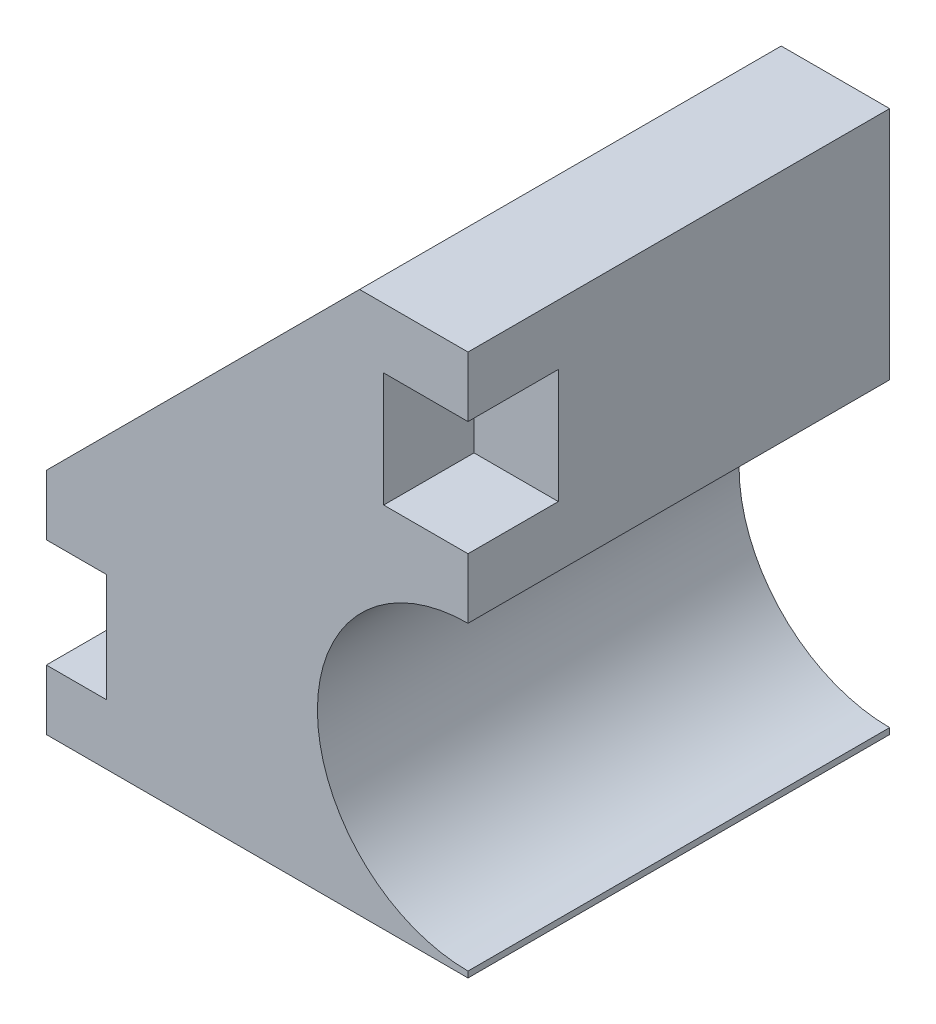
ISO-10303-21;
HEADER;
FILE_DESCRIPTION(('STEP AP214'),'2;1');
FILE_NAME('part.step','',(''),(''),'','','');
FILE_SCHEMA(('AUTOMOTIVE_DESIGN { 1 0 10303 214 1 1 1 1 }'));
ENDSEC;
DATA;
#1=APPLICATION_CONTEXT('core data for automotive mechanical design processes');
#2=APPLICATION_PROTOCOL_DEFINITION('international standard','automotive_design',2000,#1);
#3=PRODUCT_CONTEXT('',#1,'mechanical');
#4=PRODUCT('Part','Part','',(#3));
#5=PRODUCT_RELATED_PRODUCT_CATEGORY('part','',(#4));
#6=PRODUCT_DEFINITION_FORMATION('','',#4);
#7=PRODUCT_DEFINITION_CONTEXT('part definition',#1,'design');
#8=PRODUCT_DEFINITION('design','',#6,#7);
#9=PRODUCT_DEFINITION_SHAPE('','',#8);
#10=(LENGTH_UNIT() NAMED_UNIT(*) SI_UNIT(.MILLI.,.METRE.));
#11=(NAMED_UNIT(*) PLANE_ANGLE_UNIT() SI_UNIT($,.RADIAN.));
#12=(NAMED_UNIT(*) SI_UNIT($,.STERADIAN.) SOLID_ANGLE_UNIT());
#13=UNCERTAINTY_MEASURE_WITH_UNIT(LENGTH_MEASURE(1.E-05),#10,'distance_accuracy_value','');
#14=(GEOMETRIC_REPRESENTATION_CONTEXT(3) GLOBAL_UNCERTAINTY_ASSIGNED_CONTEXT((#13)) GLOBAL_UNIT_ASSIGNED_CONTEXT((#10,
#11,#12)) REPRESENTATION_CONTEXT('',''));
#15=CARTESIAN_POINT('',(0.,0.,0.));
#16=DIRECTION('',(0.,0.,1.));
#17=DIRECTION('',(1.,0.,0.));
#18=AXIS2_PLACEMENT_3D('',#15,#16,#17);
#19=CARTESIAN_POINT('',(0.,13.,0.));
#20=DIRECTION('',(0.,0.,1.));
#21=DIRECTION('',(1.,0.,0.));
#22=AXIS2_PLACEMENT_3D('',#19,#20,#21);
#23=PLANE('',#22);
#24=DIRECTION('',(0.,1.,0.));
#25=VECTOR('',#24,1.);
#26=CARTESIAN_POINT('',(0.,0.5,0.));
#27=LINE('',#26,#25);
#28=CARTESIAN_POINT('',(0.,0.,0.));
#29=VERTEX_POINT('',#28);
#30=CARTESIAN_POINT('',(0.,0.5,0.));
#31=VERTEX_POINT('',#30);
#32=EDGE_CURVE('E242',#29,#31,#27,.T.);
#33=ORIENTED_EDGE('',*,*,#32,.F.);
#34=DIRECTION('',(1.,0.,0.));
#35=VECTOR('',#34,1.);
#36=CARTESIAN_POINT('',(0.,0.,0.));
#37=LINE('',#36,#35);
#38=CARTESIAN_POINT('',(-35.,0.,0.));
#39=VERTEX_POINT('',#38);
#40=EDGE_CURVE('E266',#39,#29,#37,.T.);
#41=ORIENTED_EDGE('',*,*,#40,.F.);
#42=DIRECTION('',(0.,-1.,0.));
#43=VECTOR('',#42,1.);
#44=CARTESIAN_POINT('',(-35.,18.9999999999999,0.));
#45=LINE('',#44,#43);
#46=CARTESIAN_POINT('',(-35.,18.9999999999999,0.));
#47=VERTEX_POINT('',#46);
#48=EDGE_CURVE('E262',#47,#39,#45,.T.);
#49=ORIENTED_EDGE('',*,*,#48,.F.);
#50=DIRECTION('',(-0.707106781186546,-0.707106781186549,0.));
#51=VECTOR('',#50,1.);
#52=CARTESIAN_POINT('',(-9.,45.,0.));
#53=LINE('',#52,#51);
#54=CARTESIAN_POINT('',(-9.,45.,0.));
#55=VERTEX_POINT('',#54);
#56=EDGE_CURVE('E258',#55,#47,#53,.T.);
#57=ORIENTED_EDGE('',*,*,#56,.F.);
#58=DIRECTION('',(-1.,0.,0.));
#59=VECTOR('',#58,1.);
#60=CARTESIAN_POINT('',(0.,45.,0.));
#61=LINE('',#60,#59);
#62=CARTESIAN_POINT('',(0.,45.,0.));
#63=VERTEX_POINT('',#62);
#64=EDGE_CURVE('E254',#63,#55,#61,.T.);
#65=ORIENTED_EDGE('',*,*,#64,.F.);
#66=DIRECTION('',(0.,1.,0.));
#67=VECTOR('',#66,1.);
#68=CARTESIAN_POINT('',(0.,45.,0.));
#69=LINE('',#68,#67);
#70=CARTESIAN_POINT('',(0.,25.5,0.));
#71=VERTEX_POINT('',#70);
#72=EDGE_CURVE('E250',#71,#63,#69,.T.);
#73=ORIENTED_EDGE('',*,*,#72,.F.);
#74=CARTESIAN_POINT('',(0.,13.,0.));
#75=DIRECTION('',(0.,0.,-1.));
#76=DIRECTION('',(1.,0.,0.));
#77=AXIS2_PLACEMENT_3D('',#74,#75,#76);
#78=CIRCLE('',#77,12.5);
#79=EDGE_CURVE('E246',#31,#71,#78,.T.);
#80=ORIENTED_EDGE('',*,*,#79,.F.);
#81=EDGE_LOOP('',(#33,#41,#49,#57,#65,#73,#80));
#82=FACE_BOUND('',#81,.T.);
#83=ADVANCED_FACE('F39',(#82),#23,.F.);
#84=CARTESIAN_POINT('',(0.,0.,150.));
#85=DIRECTION('',(0.,1.,0.));
#86=DIRECTION('',(-1.,0.,0.));
#87=AXIS2_PLACEMENT_3D('',#84,#85,#86);
#88=PLANE('',#87);
#89=DIRECTION('',(0.,0.,-1.));
#90=VECTOR('',#89,1.);
#91=CARTESIAN_POINT('',(0.,0.,150.));
#92=LINE('',#91,#90);
#93=CARTESIAN_POINT('',(0.,0.,35.));
#94=VERTEX_POINT('',#93);
#95=EDGE_CURVE('E270',#94,#29,#92,.T.);
#96=ORIENTED_EDGE('',*,*,#95,.F.);
#97=DIRECTION('',(1.,0.,0.));
#98=VECTOR('',#97,1.);
#99=CARTESIAN_POINT('',(-35.,0.,35.));
#100=LINE('',#99,#98);
#101=CARTESIAN_POINT('',(-35.,0.,35.));
#102=VERTEX_POINT('',#101);
#103=EDGE_CURVE('E210',#102,#94,#100,.T.);
#104=ORIENTED_EDGE('',*,*,#103,.F.);
#105=DIRECTION('',(0.,0.,-1.));
#106=VECTOR('',#105,1.);
#107=CARTESIAN_POINT('',(-35.,0.,150.));
#108=LINE('',#107,#106);
#109=EDGE_CURVE('E273',#102,#39,#108,.T.);
#110=ORIENTED_EDGE('',*,*,#109,.T.);
#111=ORIENTED_EDGE('',*,*,#40,.T.);
#112=EDGE_LOOP('',(#96,#104,#110,#111));
#113=FACE_BOUND('',#112,.T.);
#114=ADVANCED_FACE('F338',(#113),#88,.F.);
#115=CARTESIAN_POINT('',(-35.,18.9999999999999,150.));
#116=DIRECTION('',(1.,0.,0.));
#117=DIRECTION('',(0.,0.,-1.));
#118=AXIS2_PLACEMENT_3D('',#115,#116,#117);
#119=PLANE('',#118);
#120=DIRECTION('',(0.,-1.,0.));
#121=VECTOR('',#120,1.);
#122=CARTESIAN_POINT('',(-35.,150.,35.));
#123=LINE('',#122,#121);
#124=CARTESIAN_POINT('',(-35.,5.,35.));
#125=VERTEX_POINT('',#124);
#126=EDGE_CURVE('E221',#125,#102,#123,.T.);
#127=ORIENTED_EDGE('',*,*,#126,.F.);
#128=DIRECTION('',(0.,0.,1.));
#129=VECTOR('',#128,1.);
#130=CARTESIAN_POINT('',(-35.,5.,35.));
#131=LINE('',#130,#129);
#132=CARTESIAN_POINT('',(-35.,4.99999999999999,27.5));
#133=VERTEX_POINT('',#132);
#134=EDGE_CURVE('E166',#133,#125,#131,.T.);
#135=ORIENTED_EDGE('',*,*,#134,.F.);
#136=DIRECTION('',(0.,-1.,0.));
#137=VECTOR('',#136,1.);
#138=CARTESIAN_POINT('',(-35.,13.9999999999999,27.5));
#139=LINE('',#138,#137);
#140=CARTESIAN_POINT('',(-35.,13.9999999999999,27.5));
#141=VERTEX_POINT('',#140);
#142=EDGE_CURVE('E319',#141,#133,#139,.T.);
#143=ORIENTED_EDGE('',*,*,#142,.F.);
#144=DIRECTION('',(0.,0.,-1.));
#145=VECTOR('',#144,1.);
#146=CARTESIAN_POINT('',(-35.,13.9999999999999,35.));
#147=LINE('',#146,#145);
#148=CARTESIAN_POINT('',(-35.,13.9999999999999,35.));
#149=VERTEX_POINT('',#148);
#150=EDGE_CURVE('E322',#149,#141,#147,.T.);
#151=ORIENTED_EDGE('',*,*,#150,.F.);
#152=CARTESIAN_POINT('',(-35.,18.9999999999999,35.));
#153=VERTEX_POINT('',#152);
#154=EDGE_CURVE('E171',#153,#149,#123,.T.);
#155=ORIENTED_EDGE('',*,*,#154,.F.);
#156=DIRECTION('',(0.,0.,-1.));
#157=VECTOR('',#156,1.);
#158=CARTESIAN_POINT('',(-35.,18.9999999999999,150.));
#159=LINE('',#158,#157);
#160=EDGE_CURVE('E276',#153,#47,#159,.T.);
#161=ORIENTED_EDGE('',*,*,#160,.T.);
#162=ORIENTED_EDGE('',*,*,#48,.T.);
#163=ORIENTED_EDGE('',*,*,#109,.F.);
#164=EDGE_LOOP('',(#127,#135,#143,#151,#155,#161,#162,#163));
#165=FACE_BOUND('',#164,.T.);
#166=ADVANCED_FACE('F333',(#165),#119,.F.);
#167=CARTESIAN_POINT('',(-9.,45.,150.));
#168=DIRECTION('',(0.707106781186549,-0.707106781186546,0.));
#169=DIRECTION('',(0.707106781186546,0.707106781186549,0.));
#170=AXIS2_PLACEMENT_3D('',#167,#168,#169);
#171=PLANE('',#170);
#172=ORIENTED_EDGE('',*,*,#160,.F.);
#173=DIRECTION('',(0.707106781186546,0.707106781186549,0.));
#174=VECTOR('',#173,1.);
#175=CARTESIAN_POINT('',(-9.,45.,35.));
#176=LINE('',#175,#174);
#177=CARTESIAN_POINT('',(-9.,45.,35.));
#178=VERTEX_POINT('',#177);
#179=EDGE_CURVE('E230',#153,#178,#176,.T.);
#180=ORIENTED_EDGE('',*,*,#179,.T.);
#181=DIRECTION('',(0.,0.,-1.));
#182=VECTOR('',#181,1.);
#183=CARTESIAN_POINT('',(-9.,45.,150.));
#184=LINE('',#183,#182);
#185=EDGE_CURVE('E279',#178,#55,#184,.T.);
#186=ORIENTED_EDGE('',*,*,#185,.T.);
#187=ORIENTED_EDGE('',*,*,#56,.T.);
#188=EDGE_LOOP('',(#172,#180,#186,#187));
#189=FACE_BOUND('',#188,.T.);
#190=ADVANCED_FACE('F357',(#189),#171,.F.);
#191=CARTESIAN_POINT('',(0.,45.,150.));
#192=DIRECTION('',(0.,-1.,0.));
#193=DIRECTION('',(0.,0.,-1.));
#194=AXIS2_PLACEMENT_3D('',#191,#192,#193);
#195=PLANE('',#194);
#196=ORIENTED_EDGE('',*,*,#185,.F.);
#197=DIRECTION('',(1.,0.,0.));
#198=VECTOR('',#197,1.);
#199=CARTESIAN_POINT('',(0.,45.,35.));
#200=LINE('',#199,#198);
#201=CARTESIAN_POINT('',(0.,45.,35.));
#202=VERTEX_POINT('',#201);
#203=EDGE_CURVE('E234',#178,#202,#200,.T.);
#204=ORIENTED_EDGE('',*,*,#203,.T.);
#205=DIRECTION('',(0.,0.,-1.));
#206=VECTOR('',#205,1.);
#207=CARTESIAN_POINT('',(0.,45.,150.));
#208=LINE('',#207,#206);
#209=EDGE_CURVE('E282',#202,#63,#208,.T.);
#210=ORIENTED_EDGE('',*,*,#209,.T.);
#211=ORIENTED_EDGE('',*,*,#64,.T.);
#212=EDGE_LOOP('',(#196,#204,#210,#211));
#213=FACE_BOUND('',#212,.T.);
#214=ADVANCED_FACE('F305',(#213),#195,.F.);
#215=CARTESIAN_POINT('',(0.,45.,150.));
#216=DIRECTION('',(-1.,0.,0.));
#217=DIRECTION('',(0.,-1.,0.));
#218=AXIS2_PLACEMENT_3D('',#215,#216,#217);
#219=PLANE('',#218);
#220=DIRECTION('',(0.,-1.,0.));
#221=VECTOR('',#220,1.);
#222=CARTESIAN_POINT('',(0.,150.,35.));
#223=LINE('',#222,#221);
#224=CARTESIAN_POINT('',(0.,40.,35.));
#225=VERTEX_POINT('',#224);
#226=EDGE_CURVE('E227',#202,#225,#223,.T.);
#227=ORIENTED_EDGE('',*,*,#226,.T.);
#228=DIRECTION('',(0.,0.,1.));
#229=VECTOR('',#228,1.);
#230=CARTESIAN_POINT('',(0.,40.,35.));
#231=LINE('',#230,#229);
#232=CARTESIAN_POINT('',(0.,40.,27.5));
#233=VERTEX_POINT('',#232);
#234=EDGE_CURVE('E185',#233,#225,#231,.T.);
#235=ORIENTED_EDGE('',*,*,#234,.F.);
#236=DIRECTION('',(0.,1.,0.));
#237=VECTOR('',#236,1.);
#238=CARTESIAN_POINT('',(0.,40.,27.5));
#239=LINE('',#238,#237);
#240=CARTESIAN_POINT('',(0.,30.5,27.5));
#241=VERTEX_POINT('',#240);
#242=EDGE_CURVE('E199',#241,#233,#239,.T.);
#243=ORIENTED_EDGE('',*,*,#242,.F.);
#244=DIRECTION('',(0.,0.,-1.));
#245=VECTOR('',#244,1.);
#246=CARTESIAN_POINT('',(0.,30.5,35.));
#247=LINE('',#246,#245);
#248=CARTESIAN_POINT('',(0.,30.5,35.));
#249=VERTEX_POINT('',#248);
#250=EDGE_CURVE('E195',#249,#241,#247,.T.);
#251=ORIENTED_EDGE('',*,*,#250,.F.);
#252=CARTESIAN_POINT('',(0.,25.5,35.));
#253=VERTEX_POINT('',#252);
#254=EDGE_CURVE('E226',#249,#253,#223,.T.);
#255=ORIENTED_EDGE('',*,*,#254,.T.);
#256=DIRECTION('',(0.,0.,-1.));
#257=VECTOR('',#256,1.);
#258=CARTESIAN_POINT('',(0.,25.5,150.));
#259=LINE('',#258,#257);
#260=EDGE_CURVE('E48',#253,#71,#259,.T.);
#261=ORIENTED_EDGE('',*,*,#260,.T.);
#262=ORIENTED_EDGE('',*,*,#72,.T.);
#263=ORIENTED_EDGE('',*,*,#209,.F.);
#264=EDGE_LOOP('',(#227,#235,#243,#251,#255,#261,#262,#263));
#265=FACE_BOUND('',#264,.T.);
#266=ADVANCED_FACE('F288',(#265),#219,.F.);
#267=CARTESIAN_POINT('',(0.,13.,150.));
#268=DIRECTION('',(0.,0.,-1.));
#269=DIRECTION('',(-1.,0.,0.));
#270=AXIS2_PLACEMENT_3D('',#267,#268,#269);
#271=CYLINDRICAL_SURFACE('',#270,12.5);
#272=ORIENTED_EDGE('',*,*,#260,.F.);
#273=CARTESIAN_POINT('',(0.,13.,35.));
#274=DIRECTION('',(0.,0.,-1.));
#275=DIRECTION('',(-1.,0.,0.));
#276=AXIS2_PLACEMENT_3D('',#273,#274,#275);
#277=CIRCLE('',#276,12.5);
#278=CARTESIAN_POINT('',(0.,0.5,35.));
#279=VERTEX_POINT('',#278);
#280=EDGE_CURVE('E238',#253,#279,#277,.F.);
#281=ORIENTED_EDGE('',*,*,#280,.T.);
#282=DIRECTION('',(0.,0.,-1.));
#283=VECTOR('',#282,1.);
#284=CARTESIAN_POINT('',(0.,0.5,150.));
#285=LINE('',#284,#283);
#286=EDGE_CURVE('E11',#279,#31,#285,.T.);
#287=ORIENTED_EDGE('',*,*,#286,.T.);
#288=ORIENTED_EDGE('',*,*,#79,.T.);
#289=EDGE_LOOP('',(#272,#281,#287,#288));
#290=FACE_BOUND('',#289,.T.);
#291=ADVANCED_FACE('F297',(#290),#271,.F.);
#292=CARTESIAN_POINT('',(0.,0.5,150.));
#293=DIRECTION('',(-1.,0.,0.));
#294=DIRECTION('',(0.,-1.,0.));
#295=AXIS2_PLACEMENT_3D('',#292,#293,#294);
#296=PLANE('',#295);
#297=ORIENTED_EDGE('',*,*,#286,.F.);
#298=EDGE_CURVE('E222',#279,#94,#223,.T.);
#299=ORIENTED_EDGE('',*,*,#298,.T.);
#300=ORIENTED_EDGE('',*,*,#95,.T.);
#301=ORIENTED_EDGE('',*,*,#32,.T.);
#302=EDGE_LOOP('',(#297,#299,#300,#301));
#303=FACE_BOUND('',#302,.T.);
#304=ADVANCED_FACE('F41',(#303),#296,.F.);
#305=CARTESIAN_POINT('',(-35.,150.,35.));
#306=DIRECTION('',(0.,0.,-1.));
#307=DIRECTION('',(-1.,0.,0.));
#308=AXIS2_PLACEMENT_3D('',#305,#306,#307);
#309=PLANE('',#308);
#310=DIRECTION('',(0.,1.,0.));
#311=VECTOR('',#310,1.);
#312=CARTESIAN_POINT('',(-30.,13.9999999999999,35.));
#313=LINE('',#312,#311);
#314=CARTESIAN_POINT('',(-30.,5.,35.));
#315=VERTEX_POINT('',#314);
#316=CARTESIAN_POINT('',(-30.,13.9999999999999,35.));
#317=VERTEX_POINT('',#316);
#318=EDGE_CURVE('E159',#315,#317,#313,.T.);
#319=ORIENTED_EDGE('',*,*,#318,.F.);
#320=DIRECTION('',(-1.,0.,0.));
#321=VECTOR('',#320,1.);
#322=CARTESIAN_POINT('',(-30.,5.,35.));
#323=LINE('',#322,#321);
#324=EDGE_CURVE('E200',#315,#125,#323,.T.);
#325=ORIENTED_EDGE('',*,*,#324,.T.);
#326=ORIENTED_EDGE('',*,*,#126,.T.);
#327=ORIENTED_EDGE('',*,*,#103,.T.);
#328=ORIENTED_EDGE('',*,*,#298,.F.);
#329=ORIENTED_EDGE('',*,*,#280,.F.);
#330=ORIENTED_EDGE('',*,*,#254,.F.);
#331=DIRECTION('',(1.,0.,0.));
#332=VECTOR('',#331,1.);
#333=CARTESIAN_POINT('',(-7.,30.5,35.));
#334=LINE('',#333,#332);
#335=CARTESIAN_POINT('',(-7.,30.5,35.));
#336=VERTEX_POINT('',#335);
#337=EDGE_CURVE('E194',#336,#249,#334,.T.);
#338=ORIENTED_EDGE('',*,*,#337,.F.);
#339=DIRECTION('',(0.,-1.,0.));
#340=VECTOR('',#339,1.);
#341=CARTESIAN_POINT('',(-7.,40.,35.));
#342=LINE('',#341,#340);
#343=CARTESIAN_POINT('',(-7.,40.,35.));
#344=VERTEX_POINT('',#343);
#345=EDGE_CURVE('E181',#344,#336,#342,.T.);
#346=ORIENTED_EDGE('',*,*,#345,.F.);
#347=DIRECTION('',(1.,0.,0.));
#348=VECTOR('',#347,1.);
#349=CARTESIAN_POINT('',(-7.,40.,35.));
#350=LINE('',#349,#348);
#351=EDGE_CURVE('E206',#344,#225,#350,.T.);
#352=ORIENTED_EDGE('',*,*,#351,.T.);
#353=ORIENTED_EDGE('',*,*,#226,.F.);
#354=ORIENTED_EDGE('',*,*,#203,.F.);
#355=ORIENTED_EDGE('',*,*,#179,.F.);
#356=ORIENTED_EDGE('',*,*,#154,.T.);
#357=DIRECTION('',(-1.,0.,0.));
#358=VECTOR('',#357,1.);
#359=CARTESIAN_POINT('',(-30.,13.9999999999999,35.));
#360=LINE('',#359,#358);
#361=EDGE_CURVE('E153',#317,#149,#360,.T.);
#362=ORIENTED_EDGE('',*,*,#361,.F.);
#363=EDGE_LOOP('',(#319,#325,#326,#327,#328,#329,#330,#338,#346,#352,#353,#354,#355,#356,#362));
#364=FACE_BOUND('',#363,.T.);
#365=ADVANCED_FACE('F169',(#364),#309,.F.);
#366=CARTESIAN_POINT('',(-7.,40.,35.));
#367=DIRECTION('',(0.,1.,0.));
#368=DIRECTION('',(-1.,0.,0.));
#369=AXIS2_PLACEMENT_3D('',#366,#367,#368);
#370=PLANE('',#369);
#371=ORIENTED_EDGE('',*,*,#234,.T.);
#372=ORIENTED_EDGE('',*,*,#351,.F.);
#373=DIRECTION('',(0.,0.,1.));
#374=VECTOR('',#373,1.);
#375=CARTESIAN_POINT('',(-7.,40.,35.));
#376=LINE('',#375,#374);
#377=CARTESIAN_POINT('',(-7.,40.,27.5));
#378=VERTEX_POINT('',#377);
#379=EDGE_CURVE('E63',#378,#344,#376,.T.);
#380=ORIENTED_EDGE('',*,*,#379,.F.);
#381=DIRECTION('',(1.,0.,0.));
#382=VECTOR('',#381,1.);
#383=CARTESIAN_POINT('',(-7.,40.,27.5));
#384=LINE('',#383,#382);
#385=EDGE_CURVE('E211',#378,#233,#384,.T.);
#386=ORIENTED_EDGE('',*,*,#385,.T.);
#387=EDGE_LOOP('',(#371,#372,#380,#386));
#388=FACE_BOUND('',#387,.T.);
#389=ADVANCED_FACE('F345',(#388),#370,.F.);
#390=CARTESIAN_POINT('',(-7.,40.,27.5));
#391=DIRECTION('',(0.,0.,-1.));
#392=DIRECTION('',(-1.,0.,0.));
#393=AXIS2_PLACEMENT_3D('',#390,#391,#392);
#394=PLANE('',#393);
#395=ORIENTED_EDGE('',*,*,#242,.T.);
#396=ORIENTED_EDGE('',*,*,#385,.F.);
#397=DIRECTION('',(0.,1.,0.));
#398=VECTOR('',#397,1.);
#399=CARTESIAN_POINT('',(-7.,40.,27.5));
#400=LINE('',#399,#398);
#401=CARTESIAN_POINT('',(-7.,30.5,27.5));
#402=VERTEX_POINT('',#401);
#403=EDGE_CURVE('E189',#402,#378,#400,.T.);
#404=ORIENTED_EDGE('',*,*,#403,.F.);
#405=DIRECTION('',(1.,0.,0.));
#406=VECTOR('',#405,1.);
#407=CARTESIAN_POINT('',(-7.,30.5,27.5));
#408=LINE('',#407,#406);
#409=EDGE_CURVE('E214',#402,#241,#408,.T.);
#410=ORIENTED_EDGE('',*,*,#409,.T.);
#411=EDGE_LOOP('',(#395,#396,#404,#410));
#412=FACE_BOUND('',#411,.T.);
#413=ADVANCED_FACE('F414',(#412),#394,.F.);
#414=CARTESIAN_POINT('',(-7.,30.5,35.));
#415=DIRECTION('',(0.,-1.,0.));
#416=DIRECTION('',(1.,0.,0.));
#417=AXIS2_PLACEMENT_3D('',#414,#415,#416);
#418=PLANE('',#417);
#419=ORIENTED_EDGE('',*,*,#250,.T.);
#420=ORIENTED_EDGE('',*,*,#409,.F.);
#421=DIRECTION('',(0.,0.,-1.));
#422=VECTOR('',#421,1.);
#423=CARTESIAN_POINT('',(-7.,30.5,35.));
#424=LINE('',#423,#422);
#425=EDGE_CURVE('E184',#336,#402,#424,.T.);
#426=ORIENTED_EDGE('',*,*,#425,.F.);
#427=ORIENTED_EDGE('',*,*,#337,.T.);
#428=EDGE_LOOP('',(#419,#420,#426,#427));
#429=FACE_BOUND('',#428,.T.);
#430=ADVANCED_FACE('F423',(#429),#418,.F.);
#431=CARTESIAN_POINT('',(-7.,0.,0.));
#432=DIRECTION('',(1.,0.,0.));
#433=DIRECTION('',(0.,1.,0.));
#434=AXIS2_PLACEMENT_3D('',#431,#432,#433);
#435=PLANE('',#434);
#436=ORIENTED_EDGE('',*,*,#345,.T.);
#437=ORIENTED_EDGE('',*,*,#425,.T.);
#438=ORIENTED_EDGE('',*,*,#403,.T.);
#439=ORIENTED_EDGE('',*,*,#379,.T.);
#440=EDGE_LOOP('',(#436,#437,#438,#439));
#441=FACE_BOUND('',#440,.T.);
#442=ADVANCED_FACE('F432',(#441),#435,.T.);
#443=CARTESIAN_POINT('',(-30.,5.,35.));
#444=DIRECTION('',(0.,-1.,0.));
#445=DIRECTION('',(0.,0.,-1.));
#446=AXIS2_PLACEMENT_3D('',#443,#444,#445);
#447=PLANE('',#446);
#448=ORIENTED_EDGE('',*,*,#134,.T.);
#449=ORIENTED_EDGE('',*,*,#324,.F.);
#450=DIRECTION('',(0.,0.,1.));
#451=VECTOR('',#450,1.);
#452=CARTESIAN_POINT('',(-30.,5.,35.));
#453=LINE('',#452,#451);
#454=CARTESIAN_POINT('',(-30.,4.99999999999999,27.5));
#455=VERTEX_POINT('',#454);
#456=EDGE_CURVE('E55',#455,#315,#453,.T.);
#457=ORIENTED_EDGE('',*,*,#456,.F.);
#458=DIRECTION('',(-1.,0.,0.));
#459=VECTOR('',#458,1.);
#460=CARTESIAN_POINT('',(-30.,4.99999999999999,27.5));
#461=LINE('',#460,#459);
#462=EDGE_CURVE('E176',#455,#133,#461,.T.);
#463=ORIENTED_EDGE('',*,*,#462,.T.);
#464=EDGE_LOOP('',(#448,#449,#457,#463));
#465=FACE_BOUND('',#464,.T.);
#466=ADVANCED_FACE('F327',(#465),#447,.F.);
#467=CARTESIAN_POINT('',(-30.,13.9999999999999,27.5));
#468=DIRECTION('',(0.,0.,-1.));
#469=DIRECTION('',(-1.,0.,0.));
#470=AXIS2_PLACEMENT_3D('',#467,#468,#469);
#471=PLANE('',#470);
#472=ORIENTED_EDGE('',*,*,#142,.T.);
#473=ORIENTED_EDGE('',*,*,#462,.F.);
#474=DIRECTION('',(0.,-1.,0.));
#475=VECTOR('',#474,1.);
#476=CARTESIAN_POINT('',(-30.,13.9999999999999,27.5));
#477=LINE('',#476,#475);
#478=CARTESIAN_POINT('',(-30.,13.9999999999999,27.5));
#479=VERTEX_POINT('',#478);
#480=EDGE_CURVE('E158',#479,#455,#477,.T.);
#481=ORIENTED_EDGE('',*,*,#480,.F.);
#482=DIRECTION('',(-1.,0.,0.));
#483=VECTOR('',#482,1.);
#484=CARTESIAN_POINT('',(-30.,13.9999999999999,27.5));
#485=LINE('',#484,#483);
#486=EDGE_CURVE('E155',#479,#141,#485,.T.);
#487=ORIENTED_EDGE('',*,*,#486,.T.);
#488=EDGE_LOOP('',(#472,#473,#481,#487));
#489=FACE_BOUND('',#488,.T.);
#490=ADVANCED_FACE('F446',(#489),#471,.F.);
#491=CARTESIAN_POINT('',(-30.,13.9999999999999,35.));
#492=DIRECTION('',(0.,1.,0.));
#493=DIRECTION('',(0.,0.,1.));
#494=AXIS2_PLACEMENT_3D('',#491,#492,#493);
#495=PLANE('',#494);
#496=ORIENTED_EDGE('',*,*,#150,.T.);
#497=ORIENTED_EDGE('',*,*,#486,.F.);
#498=DIRECTION('',(0.,0.,-1.));
#499=VECTOR('',#498,1.);
#500=CARTESIAN_POINT('',(-30.,13.9999999999999,35.));
#501=LINE('',#500,#499);
#502=EDGE_CURVE('E149',#317,#479,#501,.T.);
#503=ORIENTED_EDGE('',*,*,#502,.F.);
#504=ORIENTED_EDGE('',*,*,#361,.T.);
#505=EDGE_LOOP('',(#496,#497,#503,#504));
#506=FACE_BOUND('',#505,.T.);
#507=ADVANCED_FACE('F151',(#506),#495,.F.);
#508=CARTESIAN_POINT('',(-30.,0.,0.));
#509=DIRECTION('',(1.,0.,0.));
#510=DIRECTION('',(0.,0.,-1.));
#511=AXIS2_PLACEMENT_3D('',#508,#509,#510);
#512=PLANE('',#511);
#513=ORIENTED_EDGE('',*,*,#318,.T.);
#514=ORIENTED_EDGE('',*,*,#502,.T.);
#515=ORIENTED_EDGE('',*,*,#480,.T.);
#516=ORIENTED_EDGE('',*,*,#456,.T.);
#517=EDGE_LOOP('',(#513,#514,#515,#516));
#518=FACE_BOUND('',#517,.T.);
#519=ADVANCED_FACE('F162',(#518),#512,.F.);
#520=CLOSED_SHELL('',(#83,#114,#166,#190,#214,#266,#291,#304,#365,#389,#413,#430,#442,#466,#490,
#507,#519));
#521=MANIFOLD_SOLID_BREP('B2',#520);
#522=ADVANCED_BREP_SHAPE_REPRESENTATION('',(#18,#521),#14);
#523=SHAPE_DEFINITION_REPRESENTATION(#9,#522);
ENDSEC;
END-ISO-10303-21;
